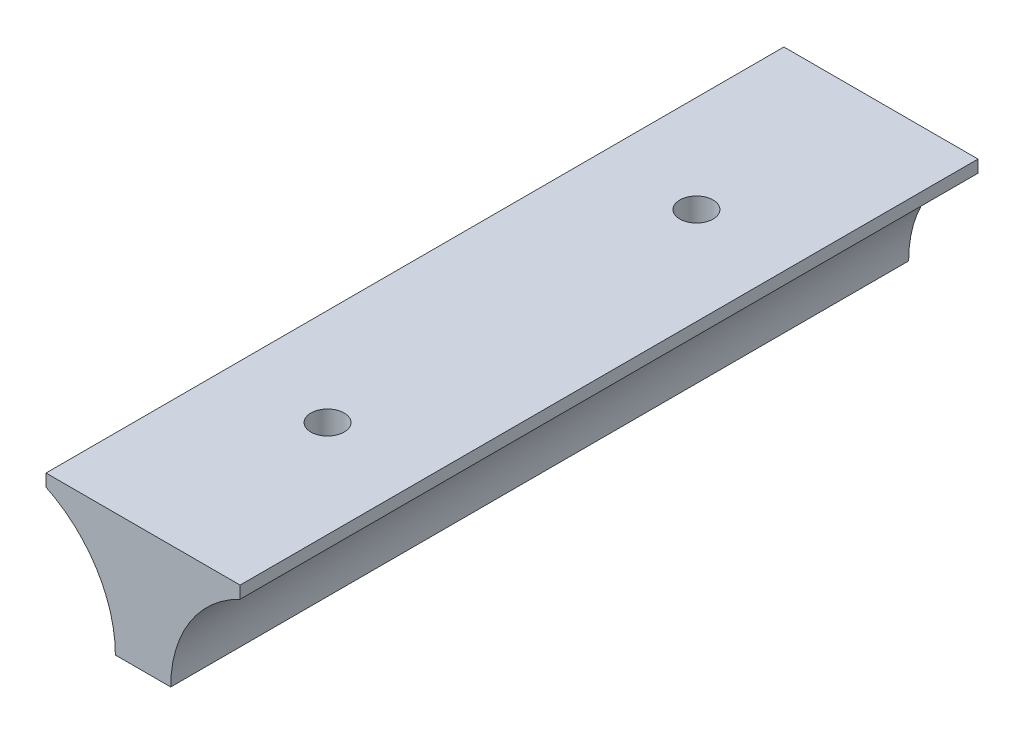
ISO-10303-21;
HEADER;
FILE_DESCRIPTION(('STEP AP214'),'2;1');
FILE_NAME('part.step','',(''),(''),'','','');
FILE_SCHEMA(('AUTOMOTIVE_DESIGN { 1 0 10303 214 1 1 1 1 }'));
ENDSEC;
DATA;
#1=APPLICATION_CONTEXT('core data for automotive mechanical design processes');
#2=APPLICATION_PROTOCOL_DEFINITION('international standard','automotive_design',2000,#1);
#3=PRODUCT_CONTEXT('',#1,'mechanical');
#4=PRODUCT('Part','Part','',(#3));
#5=PRODUCT_RELATED_PRODUCT_CATEGORY('part','',(#4));
#6=PRODUCT_DEFINITION_FORMATION('','',#4);
#7=PRODUCT_DEFINITION_CONTEXT('part definition',#1,'design');
#8=PRODUCT_DEFINITION('design','',#6,#7);
#9=PRODUCT_DEFINITION_SHAPE('','',#8);
#10=(LENGTH_UNIT() NAMED_UNIT(*) SI_UNIT(.MILLI.,.METRE.));
#11=(NAMED_UNIT(*) PLANE_ANGLE_UNIT() SI_UNIT($,.RADIAN.));
#12=(NAMED_UNIT(*) SI_UNIT($,.STERADIAN.) SOLID_ANGLE_UNIT());
#13=UNCERTAINTY_MEASURE_WITH_UNIT(LENGTH_MEASURE(1.E-05),#10,'distance_accuracy_value','');
#14=(GEOMETRIC_REPRESENTATION_CONTEXT(3) GLOBAL_UNCERTAINTY_ASSIGNED_CONTEXT((#13)) GLOBAL_UNIT_ASSIGNED_CONTEXT((#10,
#11,#12)) REPRESENTATION_CONTEXT('',''));
#15=CARTESIAN_POINT('',(0.,0.,0.));
#16=DIRECTION('',(0.,0.,1.));
#17=DIRECTION('',(1.,0.,0.));
#18=AXIS2_PLACEMENT_3D('',#15,#16,#17);
#19=CARTESIAN_POINT('',(-12.25,0.,60.));
#20=DIRECTION('',(0.,0.,-1.));
#21=DIRECTION('',(-1.,0.,0.));
#22=AXIS2_PLACEMENT_3D('',#19,#20,#21);
#23=CYLINDRICAL_SURFACE('',#22,10.);
#24=CARTESIAN_POINT('',(-12.25,0.,0.));
#25=DIRECTION('',(0.,0.,-1.));
#26=DIRECTION('',(1.,0.,0.));
#27=AXIS2_PLACEMENT_3D('',#24,#25,#26);
#28=CIRCLE('',#27,10.);
#29=CARTESIAN_POINT('',(-7.89110105645933,9.,0.));
#30=VERTEX_POINT('',#29);
#31=CARTESIAN_POINT('',(-2.25,0.,0.));
#32=VERTEX_POINT('',#31);
#33=EDGE_CURVE('E121',#30,#32,#28,.T.);
#34=ORIENTED_EDGE('',*,*,#33,.T.);
#35=DIRECTION('',(0.,0.,-1.));
#36=VECTOR('',#35,1.);
#37=CARTESIAN_POINT('',(-2.25,0.,60.));
#38=LINE('',#37,#36);
#39=CARTESIAN_POINT('',(-2.25,0.,60.));
#40=VERTEX_POINT('',#39);
#41=EDGE_CURVE('E11',#40,#32,#38,.T.);
#42=ORIENTED_EDGE('',*,*,#41,.F.);
#43=CARTESIAN_POINT('',(-12.25,0.,60.));
#44=DIRECTION('',(0.,0.,-1.));
#45=DIRECTION('',(1.,0.,0.));
#46=AXIS2_PLACEMENT_3D('',#43,#44,#45);
#47=CIRCLE('',#46,10.);
#48=CARTESIAN_POINT('',(-7.89110105645933,9.,60.));
#49=VERTEX_POINT('',#48);
#50=EDGE_CURVE('E132',#49,#40,#47,.T.);
#51=ORIENTED_EDGE('',*,*,#50,.F.);
#52=DIRECTION('',(0.,0.,-1.));
#53=VECTOR('',#52,1.);
#54=CARTESIAN_POINT('',(-7.89110105645933,9.,60.));
#55=LINE('',#54,#53);
#56=EDGE_CURVE('E117',#49,#30,#55,.T.);
#57=ORIENTED_EDGE('',*,*,#56,.T.);
#58=EDGE_LOOP('',(#34,#42,#51,#57));
#59=FACE_BOUND('',#58,.T.);
#60=ADVANCED_FACE('F37',(#59),#23,.F.);
#61=CARTESIAN_POINT('',(-2.25,0.,60.));
#62=DIRECTION('',(0.,1.,0.));
#63=DIRECTION('',(-1.,0.,0.));
#64=AXIS2_PLACEMENT_3D('',#61,#62,#63);
#65=PLANE('',#64);
#66=CARTESIAN_POINT('',(0.,0.,45.));
#67=DIRECTION('',(0.,1.,0.));
#68=DIRECTION('',(-1.,0.,0.));
#69=AXIS2_PLACEMENT_3D('',#66,#67,#68);
#70=CIRCLE('',#69,1.35);
#71=CARTESIAN_POINT('',(-1.35,0.,45.));
#72=VERTEX_POINT('',#71);
#73=EDGE_CURVE('E223',#72,#72,#70,.T.);
#74=ORIENTED_EDGE('',*,*,#73,.T.);
#75=EDGE_LOOP('',(#74));
#76=FACE_BOUND('',#75,.T.);
#77=CARTESIAN_POINT('',(0.,0.,15.));
#78=DIRECTION('',(0.,1.,0.));
#79=DIRECTION('',(-1.,0.,0.));
#80=AXIS2_PLACEMENT_3D('',#77,#78,#79);
#81=CIRCLE('',#80,1.35);
#82=CARTESIAN_POINT('',(-1.35,0.,15.));
#83=VERTEX_POINT('',#82);
#84=EDGE_CURVE('E125',#83,#83,#81,.T.);
#85=ORIENTED_EDGE('',*,*,#84,.T.);
#86=EDGE_LOOP('',(#85));
#87=FACE_BOUND('',#86,.T.);
#88=DIRECTION('',(1.,0.,0.));
#89=VECTOR('',#88,1.);
#90=CARTESIAN_POINT('',(-2.25,0.,0.));
#91=LINE('',#90,#89);
#92=CARTESIAN_POINT('',(2.25,0.,0.));
#93=VERTEX_POINT('',#92);
#94=EDGE_CURVE('E124',#32,#93,#91,.T.);
#95=ORIENTED_EDGE('',*,*,#94,.T.);
#96=DIRECTION('',(0.,0.,-1.));
#97=VECTOR('',#96,1.);
#98=CARTESIAN_POINT('',(2.25,0.,60.));
#99=LINE('',#98,#97);
#100=CARTESIAN_POINT('',(2.25,0.,60.));
#101=VERTEX_POINT('',#100);
#102=EDGE_CURVE('E45',#101,#93,#99,.T.);
#103=ORIENTED_EDGE('',*,*,#102,.F.);
#104=DIRECTION('',(1.,0.,0.));
#105=VECTOR('',#104,1.);
#106=CARTESIAN_POINT('',(-2.25,0.,60.));
#107=LINE('',#106,#105);
#108=EDGE_CURVE('E90',#40,#101,#107,.T.);
#109=ORIENTED_EDGE('',*,*,#108,.F.);
#110=ORIENTED_EDGE('',*,*,#41,.T.);
#111=EDGE_LOOP('',(#95,#103,#109,#110));
#112=FACE_BOUND('',#111,.T.);
#113=ADVANCED_FACE('F157',(#76,#87,#112),#65,.F.);
#114=CARTESIAN_POINT('',(12.25,0.,60.));
#115=DIRECTION('',(0.,0.,-1.));
#116=DIRECTION('',(-1.,0.,0.));
#117=AXIS2_PLACEMENT_3D('',#114,#115,#116);
#118=CYLINDRICAL_SURFACE('',#117,10.);
#119=CARTESIAN_POINT('',(12.25,0.,0.));
#120=DIRECTION('',(0.,0.,-1.));
#121=DIRECTION('',(-1.,0.,0.));
#122=AXIS2_PLACEMENT_3D('',#119,#120,#121);
#123=CIRCLE('',#122,10.);
#124=CARTESIAN_POINT('',(7.89110105645933,9.,0.));
#125=VERTEX_POINT('',#124);
#126=EDGE_CURVE('E127',#93,#125,#123,.T.);
#127=ORIENTED_EDGE('',*,*,#126,.T.);
#128=DIRECTION('',(0.,0.,-1.));
#129=VECTOR('',#128,1.);
#130=CARTESIAN_POINT('',(7.89110105645933,9.,60.));
#131=LINE('',#130,#129);
#132=CARTESIAN_POINT('',(7.89110105645933,9.,60.));
#133=VERTEX_POINT('',#132);
#134=EDGE_CURVE('E112',#133,#125,#131,.T.);
#135=ORIENTED_EDGE('',*,*,#134,.F.);
#136=CARTESIAN_POINT('',(12.25,0.,60.));
#137=DIRECTION('',(0.,0.,-1.));
#138=DIRECTION('',(-1.,0.,0.));
#139=AXIS2_PLACEMENT_3D('',#136,#137,#138);
#140=CIRCLE('',#139,10.);
#141=EDGE_CURVE('E103',#101,#133,#140,.T.);
#142=ORIENTED_EDGE('',*,*,#141,.F.);
#143=ORIENTED_EDGE('',*,*,#102,.T.);
#144=EDGE_LOOP('',(#127,#135,#142,#143));
#145=FACE_BOUND('',#144,.T.);
#146=ADVANCED_FACE('F138',(#145),#118,.F.);
#147=CARTESIAN_POINT('',(7.89110105645933,9.,60.));
#148=DIRECTION('',(-1.,0.,0.));
#149=DIRECTION('',(0.,0.,1.));
#150=AXIS2_PLACEMENT_3D('',#147,#148,#149);
#151=PLANE('',#150);
#152=DIRECTION('',(0.,1.,0.));
#153=VECTOR('',#152,1.);
#154=CARTESIAN_POINT('',(7.89110105645933,9.,0.));
#155=LINE('',#154,#153);
#156=CARTESIAN_POINT('',(7.89110105645933,10.,0.));
#157=VERTEX_POINT('',#156);
#158=EDGE_CURVE('E111',#125,#157,#155,.T.);
#159=ORIENTED_EDGE('',*,*,#158,.T.);
#160=DIRECTION('',(0.,0.,-1.));
#161=VECTOR('',#160,1.);
#162=CARTESIAN_POINT('',(7.89110105645933,10.,60.));
#163=LINE('',#162,#161);
#164=CARTESIAN_POINT('',(7.89110105645933,10.,60.));
#165=VERTEX_POINT('',#164);
#166=EDGE_CURVE('E108',#165,#157,#163,.T.);
#167=ORIENTED_EDGE('',*,*,#166,.F.);
#168=DIRECTION('',(0.,1.,0.));
#169=VECTOR('',#168,1.);
#170=CARTESIAN_POINT('',(7.89110105645933,9.,60.));
#171=LINE('',#170,#169);
#172=EDGE_CURVE('E97',#133,#165,#171,.T.);
#173=ORIENTED_EDGE('',*,*,#172,.F.);
#174=ORIENTED_EDGE('',*,*,#134,.T.);
#175=EDGE_LOOP('',(#159,#167,#173,#174));
#176=FACE_BOUND('',#175,.T.);
#177=ADVANCED_FACE('F109',(#176),#151,.F.);
#178=CARTESIAN_POINT('',(7.89110105645933,10.,60.));
#179=DIRECTION('',(0.,-1.,0.));
#180=DIRECTION('',(0.,0.,-1.));
#181=AXIS2_PLACEMENT_3D('',#178,#179,#180);
#182=PLANE('',#181);
#183=CARTESIAN_POINT('',(0.,10.,45.));
#184=DIRECTION('',(0.,1.,0.));
#185=DIRECTION('',(0.,0.,1.));
#186=AXIS2_PLACEMENT_3D('',#183,#184,#185);
#187=CIRCLE('',#186,1.35);
#188=CARTESIAN_POINT('',(0.,10.,46.35));
#189=VERTEX_POINT('',#188);
#190=EDGE_CURVE('E226',#189,#189,#187,.T.);
#191=ORIENTED_EDGE('',*,*,#190,.F.);
#192=EDGE_LOOP('',(#191));
#193=FACE_BOUND('',#192,.T.);
#194=CARTESIAN_POINT('',(0.,10.,15.));
#195=DIRECTION('',(0.,1.,0.));
#196=DIRECTION('',(0.,0.,1.));
#197=AXIS2_PLACEMENT_3D('',#194,#195,#196);
#198=CIRCLE('',#197,1.35);
#199=CARTESIAN_POINT('',(0.,10.,16.35));
#200=VERTEX_POINT('',#199);
#201=EDGE_CURVE('E228',#200,#200,#198,.T.);
#202=ORIENTED_EDGE('',*,*,#201,.F.);
#203=EDGE_LOOP('',(#202));
#204=FACE_BOUND('',#203,.T.);
#205=DIRECTION('',(-1.,0.,0.));
#206=VECTOR('',#205,1.);
#207=CARTESIAN_POINT('',(7.89110105645933,10.,0.));
#208=LINE('',#207,#206);
#209=CARTESIAN_POINT('',(-7.89110105645933,10.,0.));
#210=VERTEX_POINT('',#209);
#211=EDGE_CURVE('E76',#157,#210,#208,.T.);
#212=ORIENTED_EDGE('',*,*,#211,.T.);
#213=DIRECTION('',(0.,0.,-1.));
#214=VECTOR('',#213,1.);
#215=CARTESIAN_POINT('',(-7.89110105645933,10.,60.));
#216=LINE('',#215,#214);
#217=CARTESIAN_POINT('',(-7.89110105645933,10.,60.));
#218=VERTEX_POINT('',#217);
#219=EDGE_CURVE('E113',#218,#210,#216,.T.);
#220=ORIENTED_EDGE('',*,*,#219,.F.);
#221=DIRECTION('',(-1.,0.,0.));
#222=VECTOR('',#221,1.);
#223=CARTESIAN_POINT('',(7.89110105645933,10.,60.));
#224=LINE('',#223,#222);
#225=EDGE_CURVE('E101',#165,#218,#224,.T.);
#226=ORIENTED_EDGE('',*,*,#225,.F.);
#227=ORIENTED_EDGE('',*,*,#166,.T.);
#228=EDGE_LOOP('',(#212,#220,#226,#227));
#229=FACE_BOUND('',#228,.T.);
#230=ADVANCED_FACE('F115',(#193,#204,#229),#182,.F.);
#231=CARTESIAN_POINT('',(-7.89110105645933,10.,60.));
#232=DIRECTION('',(1.,0.,0.));
#233=DIRECTION('',(0.,0.,-1.));
#234=AXIS2_PLACEMENT_3D('',#231,#232,#233);
#235=PLANE('',#234);
#236=DIRECTION('',(0.,-1.,0.));
#237=VECTOR('',#236,1.);
#238=CARTESIAN_POINT('',(-7.89110105645933,10.,0.));
#239=LINE('',#238,#237);
#240=EDGE_CURVE('E82',#210,#30,#239,.T.);
#241=ORIENTED_EDGE('',*,*,#240,.T.);
#242=ORIENTED_EDGE('',*,*,#56,.F.);
#243=DIRECTION('',(0.,-1.,0.));
#244=VECTOR('',#243,1.);
#245=CARTESIAN_POINT('',(-7.89110105645933,10.,60.));
#246=LINE('',#245,#244);
#247=EDGE_CURVE('E53',#218,#49,#246,.T.);
#248=ORIENTED_EDGE('',*,*,#247,.F.);
#249=ORIENTED_EDGE('',*,*,#219,.T.);
#250=EDGE_LOOP('',(#241,#242,#248,#249));
#251=FACE_BOUND('',#250,.T.);
#252=ADVANCED_FACE('F145',(#251),#235,.F.);
#253=CARTESIAN_POINT('',(-12.25,0.,60.));
#254=DIRECTION('',(0.,0.,1.));
#255=DIRECTION('',(1.,0.,0.));
#256=AXIS2_PLACEMENT_3D('',#253,#254,#255);
#257=PLANE('',#256);
#258=ORIENTED_EDGE('',*,*,#50,.T.);
#259=ORIENTED_EDGE('',*,*,#108,.T.);
#260=ORIENTED_EDGE('',*,*,#141,.T.);
#261=ORIENTED_EDGE('',*,*,#172,.T.);
#262=ORIENTED_EDGE('',*,*,#225,.T.);
#263=ORIENTED_EDGE('',*,*,#247,.T.);
#264=EDGE_LOOP('',(#258,#259,#260,#261,#262,#263));
#265=FACE_BOUND('',#264,.T.);
#266=ADVANCED_FACE('F99',(#265),#257,.T.);
#267=CARTESIAN_POINT('',(-12.25,0.,0.));
#268=DIRECTION('',(0.,0.,1.));
#269=DIRECTION('',(1.,0.,0.));
#270=AXIS2_PLACEMENT_3D('',#267,#268,#269);
#271=PLANE('',#270);
#272=ORIENTED_EDGE('',*,*,#33,.F.);
#273=ORIENTED_EDGE('',*,*,#240,.F.);
#274=ORIENTED_EDGE('',*,*,#211,.F.);
#275=ORIENTED_EDGE('',*,*,#158,.F.);
#276=ORIENTED_EDGE('',*,*,#126,.F.);
#277=ORIENTED_EDGE('',*,*,#94,.F.);
#278=EDGE_LOOP('',(#272,#273,#274,#275,#276,#277));
#279=FACE_BOUND('',#278,.T.);
#280=ADVANCED_FACE('F141',(#279),#271,.F.);
#281=CARTESIAN_POINT('',(0.,10.,15.));
#282=DIRECTION('',(0.,1.,0.));
#283=DIRECTION('',(0.,0.,1.));
#284=AXIS2_PLACEMENT_3D('',#281,#282,#283);
#285=CYLINDRICAL_SURFACE('',#284,1.35);
#286=ORIENTED_EDGE('',*,*,#84,.F.);
#287=EDGE_LOOP('',(#286));
#288=FACE_BOUND('',#287,.T.);
#289=ORIENTED_EDGE('',*,*,#201,.T.);
#290=EDGE_LOOP('',(#289));
#291=FACE_BOUND('',#290,.T.);
#292=ADVANCED_FACE('F187',(#288,#291),#285,.F.);
#293=CARTESIAN_POINT('',(0.,10.,45.));
#294=DIRECTION('',(0.,1.,0.));
#295=DIRECTION('',(0.,0.,1.));
#296=AXIS2_PLACEMENT_3D('',#293,#294,#295);
#297=CYLINDRICAL_SURFACE('',#296,1.35);
#298=ORIENTED_EDGE('',*,*,#73,.F.);
#299=EDGE_LOOP('',(#298));
#300=FACE_BOUND('',#299,.T.);
#301=ORIENTED_EDGE('',*,*,#190,.T.);
#302=EDGE_LOOP('',(#301));
#303=FACE_BOUND('',#302,.T.);
#304=ADVANCED_FACE('F192',(#300,#303),#297,.F.);
#305=CLOSED_SHELL('',(#60,#113,#146,#177,#230,#252,#266,#280,#292,#304));
#306=MANIFOLD_SOLID_BREP('B2',#305);
#307=ADVANCED_BREP_SHAPE_REPRESENTATION('',(#18,#306),#14);
#308=SHAPE_DEFINITION_REPRESENTATION(#9,#307);
ENDSEC;
END-ISO-10303-21;
